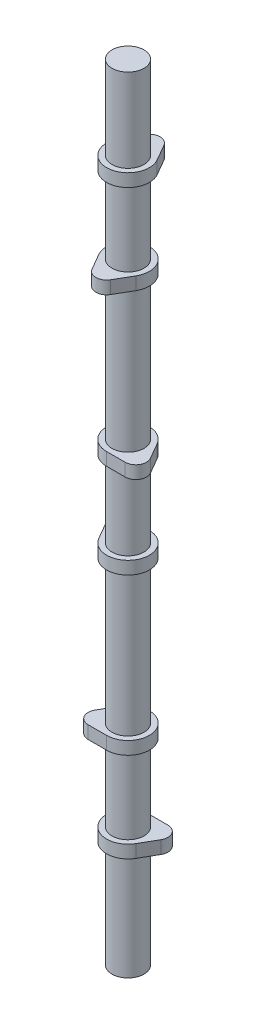
ISO-10303-21;
HEADER;
FILE_DESCRIPTION(('STEP AP214'),'2;1');
FILE_NAME('part.step','',(''),(''),'','','');
FILE_SCHEMA(('AUTOMOTIVE_DESIGN { 1 0 10303 214 1 1 1 1 }'));
ENDSEC;
DATA;
#1=APPLICATION_CONTEXT('core data for automotive mechanical design processes');
#2=APPLICATION_PROTOCOL_DEFINITION('international standard','automotive_design',2000,#1);
#3=PRODUCT_CONTEXT('',#1,'mechanical');
#4=PRODUCT('Part','Part','',(#3));
#5=PRODUCT_RELATED_PRODUCT_CATEGORY('part','',(#4));
#6=PRODUCT_DEFINITION_FORMATION('','',#4);
#7=PRODUCT_DEFINITION_CONTEXT('part definition',#1,'design');
#8=PRODUCT_DEFINITION('design','',#6,#7);
#9=PRODUCT_DEFINITION_SHAPE('','',#8);
#10=(LENGTH_UNIT() NAMED_UNIT(*) SI_UNIT(.MILLI.,.METRE.));
#11=(NAMED_UNIT(*) PLANE_ANGLE_UNIT() SI_UNIT($,.RADIAN.));
#12=(NAMED_UNIT(*) SI_UNIT($,.STERADIAN.) SOLID_ANGLE_UNIT());
#13=UNCERTAINTY_MEASURE_WITH_UNIT(LENGTH_MEASURE(1.E-05),#10,'distance_accuracy_value','');
#14=(GEOMETRIC_REPRESENTATION_CONTEXT(3) GLOBAL_UNCERTAINTY_ASSIGNED_CONTEXT((#13)) GLOBAL_UNIT_ASSIGNED_CONTEXT((#10,
#11,#12)) REPRESENTATION_CONTEXT('',''));
#15=CARTESIAN_POINT('',(0.,0.,0.));
#16=DIRECTION('',(0.,0.,1.));
#17=DIRECTION('',(1.,0.,0.));
#18=AXIS2_PLACEMENT_3D('',#15,#16,#17);
#19=CARTESIAN_POINT('',(0.,7.62,-12.7));
#20=DIRECTION('',(0.,-1.,0.));
#21=DIRECTION('',(0.,0.,-1.));
#22=AXIS2_PLACEMENT_3D('',#19,#20,#21);
#23=CYLINDRICAL_SURFACE('',#22,6.35);
#24=CARTESIAN_POINT('',(0.,0.,-12.7));
#25=DIRECTION('',(0.,1.,0.));
#26=DIRECTION('',(0.,0.,1.));
#27=AXIS2_PLACEMENT_3D('',#24,#25,#26);
#28=CIRCLE('',#27,6.35);
#29=CARTESIAN_POINT('',(5.49926131403118,0.,-15.875));
#30=VERTEX_POINT('',#29);
#31=CARTESIAN_POINT('',(-5.49926131403119,0.,-15.875));
#32=VERTEX_POINT('',#31);
#33=EDGE_CURVE('E383',#30,#32,#28,.T.);
#34=ORIENTED_EDGE('',*,*,#33,.T.);
#35=DIRECTION('',(0.,-1.,0.));
#36=VECTOR('',#35,1.);
#37=CARTESIAN_POINT('',(-5.49926131403119,7.62,-15.875));
#38=LINE('',#37,#36);
#39=CARTESIAN_POINT('',(-5.49926131403119,7.62,-15.875));
#40=VERTEX_POINT('',#39);
#41=EDGE_CURVE('E375',#40,#32,#38,.T.);
#42=ORIENTED_EDGE('',*,*,#41,.F.);
#43=CARTESIAN_POINT('',(0.,7.62,-12.7));
#44=DIRECTION('',(0.,1.,0.));
#45=DIRECTION('',(0.,0.,1.));
#46=AXIS2_PLACEMENT_3D('',#43,#44,#45);
#47=CIRCLE('',#46,6.35);
#48=CARTESIAN_POINT('',(5.49926131403118,7.62,-15.875));
#49=VERTEX_POINT('',#48);
#50=EDGE_CURVE('E376',#49,#40,#47,.T.);
#51=ORIENTED_EDGE('',*,*,#50,.F.);
#52=DIRECTION('',(0.,-1.,0.));
#53=VECTOR('',#52,1.);
#54=CARTESIAN_POINT('',(5.49926131403118,7.62,-15.875));
#55=LINE('',#54,#53);
#56=EDGE_CURVE('E382',#49,#30,#55,.T.);
#57=ORIENTED_EDGE('',*,*,#56,.T.);
#58=EDGE_LOOP('',(#34,#42,#51,#57));
#59=FACE_BOUND('',#58,.T.);
#60=ADVANCED_FACE('F37',(#59),#23,.T.);
#61=CARTESIAN_POINT('',(-5.49926131403119,7.62,-15.875));
#62=DIRECTION('',(0.866025403784439,0.,0.5));
#63=DIRECTION('',(0.5,0.,-0.866025403784439));
#64=AXIS2_PLACEMENT_3D('',#61,#62,#63);
#65=PLANE('',#64);
#66=DIRECTION('',(-0.5,0.,0.866025403784439));
#67=VECTOR('',#66,1.);
#68=CARTESIAN_POINT('',(-5.49926131403119,0.,-15.875));
#69=LINE('',#68,#67);
#70=CARTESIAN_POINT('',(-10.9985226280624,0.,-6.35));
#71=VERTEX_POINT('',#70);
#72=EDGE_CURVE('E386',#32,#71,#69,.T.);
#73=ORIENTED_EDGE('',*,*,#72,.T.);
#74=DIRECTION('',(0.,-1.,0.));
#75=VECTOR('',#74,1.);
#76=CARTESIAN_POINT('',(-10.9985226280624,7.62,-6.35));
#77=LINE('',#76,#75);
#78=CARTESIAN_POINT('',(-10.9985226280624,7.62,-6.35));
#79=VERTEX_POINT('',#78);
#80=EDGE_CURVE('E393',#79,#71,#77,.T.);
#81=ORIENTED_EDGE('',*,*,#80,.F.);
#82=DIRECTION('',(-0.5,0.,0.866025403784439));
#83=VECTOR('',#82,1.);
#84=CARTESIAN_POINT('',(-5.49926131403119,7.62,-15.875));
#85=LINE('',#84,#83);
#86=EDGE_CURVE('E85',#40,#79,#85,.T.);
#87=ORIENTED_EDGE('',*,*,#86,.F.);
#88=ORIENTED_EDGE('',*,*,#41,.T.);
#89=EDGE_LOOP('',(#73,#81,#87,#88));
#90=FACE_BOUND('',#89,.T.);
#91=ADVANCED_FACE('F462',(#90),#65,.F.);
#92=CARTESIAN_POINT('',(0.,7.62,0.));
#93=DIRECTION('',(0.,-1.,0.));
#94=DIRECTION('',(0.,0.,-1.));
#95=AXIS2_PLACEMENT_3D('',#92,#93,#94);
#96=CYLINDRICAL_SURFACE('',#95,12.7);
#97=CARTESIAN_POINT('',(0.,0.,0.));
#98=DIRECTION('',(0.,1.,0.));
#99=DIRECTION('',(0.,0.,1.));
#100=AXIS2_PLACEMENT_3D('',#97,#98,#99);
#101=CIRCLE('',#100,12.7);
#102=CARTESIAN_POINT('',(10.9985226280624,0.,-6.35000000000001));
#103=VERTEX_POINT('',#102);
#104=EDGE_CURVE('E71',#71,#103,#101,.T.);
#105=ORIENTED_EDGE('',*,*,#104,.T.);
#106=DIRECTION('',(0.,-1.,0.));
#107=VECTOR('',#106,1.);
#108=CARTESIAN_POINT('',(10.9985226280624,7.62,-6.35000000000001));
#109=LINE('',#108,#107);
#110=CARTESIAN_POINT('',(10.9985226280624,7.62,-6.35000000000001));
#111=VERTEX_POINT('',#110);
#112=EDGE_CURVE('E391',#111,#103,#109,.T.);
#113=ORIENTED_EDGE('',*,*,#112,.F.);
#114=CARTESIAN_POINT('',(0.,7.62,0.));
#115=DIRECTION('',(0.,1.,0.));
#116=DIRECTION('',(0.,0.,1.));
#117=AXIS2_PLACEMENT_3D('',#114,#115,#116);
#118=CIRCLE('',#117,12.7);
#119=EDGE_CURVE('E379',#79,#111,#118,.T.);
#120=ORIENTED_EDGE('',*,*,#119,.F.);
#121=ORIENTED_EDGE('',*,*,#80,.T.);
#122=EDGE_LOOP('',(#105,#113,#120,#121));
#123=FACE_BOUND('',#122,.T.);
#124=ADVANCED_FACE('F467',(#123),#96,.T.);
#125=CARTESIAN_POINT('',(5.49926131403118,7.62,-15.875));
#126=DIRECTION('',(-0.866025403784439,0.,0.5));
#127=DIRECTION('',(0.5,0.,0.866025403784439));
#128=AXIS2_PLACEMENT_3D('',#125,#126,#127);
#129=PLANE('',#128);
#130=DIRECTION('',(-0.5,0.,-0.866025403784439));
#131=VECTOR('',#130,1.);
#132=CARTESIAN_POINT('',(5.49926131403118,0.,-15.875));
#133=LINE('',#132,#131);
#134=EDGE_CURVE('E77',#103,#30,#133,.T.);
#135=ORIENTED_EDGE('',*,*,#134,.T.);
#136=ORIENTED_EDGE('',*,*,#56,.F.);
#137=DIRECTION('',(-0.5,0.,-0.866025403784439));
#138=VECTOR('',#137,1.);
#139=CARTESIAN_POINT('',(5.49926131403118,7.62,-15.875));
#140=LINE('',#139,#138);
#141=EDGE_CURVE('E53',#111,#49,#140,.T.);
#142=ORIENTED_EDGE('',*,*,#141,.F.);
#143=ORIENTED_EDGE('',*,*,#112,.T.);
#144=EDGE_LOOP('',(#135,#136,#142,#143));
#145=FACE_BOUND('',#144,.T.);
#146=ADVANCED_FACE('F476',(#145),#129,.F.);
#147=CARTESIAN_POINT('',(0.,7.62,-12.7));
#148=DIRECTION('',(0.,1.,0.));
#149=DIRECTION('',(0.,0.,1.));
#150=AXIS2_PLACEMENT_3D('',#147,#148,#149);
#151=PLANE('',#150);
#152=CARTESIAN_POINT('',(0.,7.62000000000002,0.));
#153=DIRECTION('',(0.,1.,0.));
#154=DIRECTION('',(0.,0.,1.));
#155=AXIS2_PLACEMENT_3D('',#152,#153,#154);
#156=CIRCLE('',#155,9.5);
#157=CARTESIAN_POINT('',(0.,7.62000000000002,9.5));
#158=VERTEX_POINT('',#157);
#159=EDGE_CURVE('E371',#158,#158,#156,.T.);
#160=ORIENTED_EDGE('',*,*,#159,.F.);
#161=EDGE_LOOP('',(#160));
#162=FACE_BOUND('',#161,.T.);
#163=ORIENTED_EDGE('',*,*,#50,.T.);
#164=ORIENTED_EDGE('',*,*,#86,.T.);
#165=ORIENTED_EDGE('',*,*,#119,.T.);
#166=ORIENTED_EDGE('',*,*,#141,.T.);
#167=EDGE_LOOP('',(#163,#164,#165,#166));
#168=FACE_BOUND('',#167,.T.);
#169=ADVANCED_FACE('F474',(#162,#168),#151,.T.);
#170=CARTESIAN_POINT('',(0.,0.,-12.7));
#171=DIRECTION('',(0.,1.,0.));
#172=DIRECTION('',(0.,0.,1.));
#173=AXIS2_PLACEMENT_3D('',#170,#171,#172);
#174=PLANE('',#173);
#175=CARTESIAN_POINT('',(0.,0.,0.));
#176=DIRECTION('',(0.,1.,0.));
#177=DIRECTION('',(0.,0.,1.));
#178=AXIS2_PLACEMENT_3D('',#175,#176,#177);
#179=CIRCLE('',#178,9.5);
#180=CARTESIAN_POINT('',(0.,0.,9.5));
#181=VERTEX_POINT('',#180);
#182=EDGE_CURVE('E367',#181,#181,#179,.T.);
#183=ORIENTED_EDGE('',*,*,#182,.T.);
#184=EDGE_LOOP('',(#183));
#185=FACE_BOUND('',#184,.T.);
#186=ORIENTED_EDGE('',*,*,#33,.F.);
#187=ORIENTED_EDGE('',*,*,#134,.F.);
#188=ORIENTED_EDGE('',*,*,#104,.F.);
#189=ORIENTED_EDGE('',*,*,#72,.F.);
#190=EDGE_LOOP('',(#186,#187,#188,#189));
#191=FACE_BOUND('',#190,.T.);
#192=ADVANCED_FACE('F472',(#185,#191),#174,.F.);
#193=CARTESIAN_POINT('',(0.,-408.94,0.));
#194=DIRECTION('',(0.,1.,0.));
#195=DIRECTION('',(0.,0.,1.));
#196=AXIS2_PLACEMENT_3D('',#193,#194,#195);
#197=CYLINDRICAL_SURFACE('',#196,9.5);
#198=CARTESIAN_POINT('',(0.,-45.72,0.));
#199=DIRECTION('',(0.,1.,0.));
#200=DIRECTION('',(0.,0.,1.));
#201=AXIS2_PLACEMENT_3D('',#198,#199,#200);
#202=CIRCLE('',#201,9.5);
#203=CARTESIAN_POINT('',(0.,-45.72,9.5));
#204=VERTEX_POINT('',#203);
#205=EDGE_CURVE('E374',#204,#204,#202,.F.);
#206=ORIENTED_EDGE('',*,*,#205,.F.);
#207=EDGE_LOOP('',(#206));
#208=FACE_BOUND('',#207,.T.);
#209=ORIENTED_EDGE('',*,*,#182,.F.);
#210=EDGE_LOOP('',(#209));
#211=FACE_BOUND('',#210,.T.);
#212=ADVANCED_FACE('F483',(#208,#211),#197,.T.);
#213=ORIENTED_EDGE('',*,*,#159,.T.);
#214=EDGE_LOOP('',(#213));
#215=FACE_BOUND('',#214,.T.);
#216=CARTESIAN_POINT('',(0.,57.15,0.));
#217=DIRECTION('',(0.,1.,0.));
#218=DIRECTION('',(0.,0.,1.));
#219=AXIS2_PLACEMENT_3D('',#216,#217,#218);
#220=CIRCLE('',#219,9.5);
#221=CARTESIAN_POINT('',(0.,57.15,9.5));
#222=VERTEX_POINT('',#221);
#223=EDGE_CURVE('E368',#222,#222,#220,.T.);
#224=ORIENTED_EDGE('',*,*,#223,.F.);
#225=EDGE_LOOP('',(#224));
#226=FACE_BOUND('',#225,.T.);
#227=ADVANCED_FACE('F488',(#215,#226),#197,.T.);
#228=CARTESIAN_POINT('',(0.,57.15,0.));
#229=DIRECTION('',(0.,1.,0.));
#230=DIRECTION('',(0.,0.,1.));
#231=AXIS2_PLACEMENT_3D('',#228,#229,#230);
#232=PLANE('',#231);
#233=ORIENTED_EDGE('',*,*,#223,.T.);
#234=EDGE_LOOP('',(#233));
#235=FACE_BOUND('',#234,.T.);
#236=ADVANCED_FACE('F534',(#235),#232,.T.);
#237=CARTESIAN_POINT('',(0.,-45.72,12.7));
#238=DIRECTION('',(0.,-1.,0.));
#239=DIRECTION('',(0.,0.,1.));
#240=AXIS2_PLACEMENT_3D('',#237,#238,#239);
#241=CYLINDRICAL_SURFACE('',#240,6.35);
#242=CARTESIAN_POINT('',(0.,-53.34,12.7));
#243=DIRECTION('',(0.,1.,0.));
#244=DIRECTION('',(0.,0.,-1.));
#245=AXIS2_PLACEMENT_3D('',#242,#243,#244);
#246=CIRCLE('',#245,6.35);
#247=CARTESIAN_POINT('',(-5.49926131403129,-53.34,15.875));
#248=VERTEX_POINT('',#247);
#249=CARTESIAN_POINT('',(5.49926131403107,-53.34,15.875));
#250=VERTEX_POINT('',#249);
#251=EDGE_CURVE('E344',#248,#250,#246,.T.);
#252=ORIENTED_EDGE('',*,*,#251,.T.);
#253=DIRECTION('',(0.,-1.,0.));
#254=VECTOR('',#253,1.);
#255=CARTESIAN_POINT('',(5.49926131403107,-45.72,15.875));
#256=LINE('',#255,#254);
#257=CARTESIAN_POINT('',(5.49926131403107,-45.72,15.875));
#258=VERTEX_POINT('',#257);
#259=EDGE_CURVE('E360',#258,#250,#256,.T.);
#260=ORIENTED_EDGE('',*,*,#259,.F.);
#261=CARTESIAN_POINT('',(0.,-45.72,12.7));
#262=DIRECTION('',(0.,1.,0.));
#263=DIRECTION('',(0.,0.,-1.));
#264=AXIS2_PLACEMENT_3D('',#261,#262,#263);
#265=CIRCLE('',#264,6.35);
#266=CARTESIAN_POINT('',(-5.49926131403129,-45.72,15.875));
#267=VERTEX_POINT('',#266);
#268=EDGE_CURVE('E333',#267,#258,#265,.T.);
#269=ORIENTED_EDGE('',*,*,#268,.F.);
#270=DIRECTION('',(0.,-1.,0.));
#271=VECTOR('',#270,1.);
#272=CARTESIAN_POINT('',(-5.49926131403129,-45.72,15.875));
#273=LINE('',#272,#271);
#274=EDGE_CURVE('E343',#267,#248,#273,.T.);
#275=ORIENTED_EDGE('',*,*,#274,.T.);
#276=EDGE_LOOP('',(#252,#260,#269,#275));
#277=FACE_BOUND('',#276,.T.);
#278=ADVANCED_FACE('F545',(#277),#241,.T.);
#279=CARTESIAN_POINT('',(5.49926131403107,-45.72,15.875));
#280=DIRECTION('',(-0.866025403784435,0.,-0.500000000000006));
#281=DIRECTION('',(-0.500000000000006,0.,0.866025403784435));
#282=AXIS2_PLACEMENT_3D('',#279,#280,#281);
#283=PLANE('',#282);
#284=DIRECTION('',(0.500000000000006,0.,-0.866025403784435));
#285=VECTOR('',#284,1.);
#286=CARTESIAN_POINT('',(5.49926131403107,-53.34,15.875));
#287=LINE('',#286,#285);
#288=CARTESIAN_POINT('',(10.9985226280623,-53.34,6.35000000000008));
#289=VERTEX_POINT('',#288);
#290=EDGE_CURVE('E347',#250,#289,#287,.T.);
#291=ORIENTED_EDGE('',*,*,#290,.T.);
#292=DIRECTION('',(0.,-1.,0.));
#293=VECTOR('',#292,1.);
#294=CARTESIAN_POINT('',(10.9985226280623,-45.72,6.35000000000008));
#295=LINE('',#294,#293);
#296=CARTESIAN_POINT('',(10.9985226280623,-45.72,6.35000000000008));
#297=VERTEX_POINT('',#296);
#298=EDGE_CURVE('E357',#297,#289,#295,.T.);
#299=ORIENTED_EDGE('',*,*,#298,.F.);
#300=DIRECTION('',(0.500000000000006,0.,-0.866025403784435));
#301=VECTOR('',#300,1.);
#302=CARTESIAN_POINT('',(5.49926131403107,-45.72,15.875));
#303=LINE('',#302,#301);
#304=EDGE_CURVE('E336',#258,#297,#303,.T.);
#305=ORIENTED_EDGE('',*,*,#304,.F.);
#306=ORIENTED_EDGE('',*,*,#259,.T.);
#307=EDGE_LOOP('',(#291,#299,#305,#306));
#308=FACE_BOUND('',#307,.T.);
#309=ADVANCED_FACE('F555',(#308),#283,.F.);
#310=CARTESIAN_POINT('',(0.,-45.72,0.));
#311=DIRECTION('',(0.,-1.,0.));
#312=DIRECTION('',(0.,0.,1.));
#313=AXIS2_PLACEMENT_3D('',#310,#311,#312);
#314=CYLINDRICAL_SURFACE('',#313,12.7);
#315=CARTESIAN_POINT('',(0.,-53.34,0.));
#316=DIRECTION('',(0.,1.,0.));
#317=DIRECTION('',(0.,0.,-1.));
#318=AXIS2_PLACEMENT_3D('',#315,#316,#317);
#319=CIRCLE('',#318,12.7);
#320=CARTESIAN_POINT('',(-10.9985226280624,-53.34,6.34999999999994));
#321=VERTEX_POINT('',#320);
#322=EDGE_CURVE('E349',#289,#321,#319,.T.);
#323=ORIENTED_EDGE('',*,*,#322,.T.);
#324=DIRECTION('',(0.,-1.,0.));
#325=VECTOR('',#324,1.);
#326=CARTESIAN_POINT('',(-10.9985226280624,-45.72,6.34999999999994));
#327=LINE('',#326,#325);
#328=CARTESIAN_POINT('',(-10.9985226280624,-45.72,6.34999999999994));
#329=VERTEX_POINT('',#328);
#330=EDGE_CURVE('E354',#329,#321,#327,.T.);
#331=ORIENTED_EDGE('',*,*,#330,.F.);
#332=CARTESIAN_POINT('',(0.,-45.72,0.));
#333=DIRECTION('',(0.,1.,0.));
#334=DIRECTION('',(0.,0.,-1.));
#335=AXIS2_PLACEMENT_3D('',#332,#333,#334);
#336=CIRCLE('',#335,12.7);
#337=EDGE_CURVE('E339',#297,#329,#336,.T.);
#338=ORIENTED_EDGE('',*,*,#337,.F.);
#339=ORIENTED_EDGE('',*,*,#298,.T.);
#340=EDGE_LOOP('',(#323,#331,#338,#339));
#341=FACE_BOUND('',#340,.T.);
#342=ADVANCED_FACE('F566',(#341),#314,.T.);
#343=CARTESIAN_POINT('',(-5.49926131403129,-45.72,15.875));
#344=DIRECTION('',(0.866025403784442,0.,-0.499999999999994));
#345=DIRECTION('',(-0.499999999999994,0.,-0.866025403784442));
#346=AXIS2_PLACEMENT_3D('',#343,#344,#345);
#347=PLANE('',#346);
#348=DIRECTION('',(0.499999999999994,0.,0.866025403784442));
#349=VECTOR('',#348,1.);
#350=CARTESIAN_POINT('',(-5.49926131403129,-53.34,15.875));
#351=LINE('',#350,#349);
#352=EDGE_CURVE('E337',#321,#248,#351,.T.);
#353=ORIENTED_EDGE('',*,*,#352,.T.);
#354=ORIENTED_EDGE('',*,*,#274,.F.);
#355=DIRECTION('',(0.499999999999994,0.,0.866025403784442));
#356=VECTOR('',#355,1.);
#357=CARTESIAN_POINT('',(-5.49926131403129,-45.72,15.875));
#358=LINE('',#357,#356);
#359=EDGE_CURVE('E341',#329,#267,#358,.T.);
#360=ORIENTED_EDGE('',*,*,#359,.F.);
#361=ORIENTED_EDGE('',*,*,#330,.T.);
#362=EDGE_LOOP('',(#353,#354,#360,#361));
#363=FACE_BOUND('',#362,.T.);
#364=ADVANCED_FACE('F577',(#363),#347,.F.);
#365=CARTESIAN_POINT('',(0.,-45.72,12.7));
#366=DIRECTION('',(0.,1.,0.));
#367=DIRECTION('',(0.,0.,-1.));
#368=AXIS2_PLACEMENT_3D('',#365,#366,#367);
#369=PLANE('',#368);
#370=ORIENTED_EDGE('',*,*,#205,.T.);
#371=EDGE_LOOP('',(#370));
#372=FACE_BOUND('',#371,.T.);
#373=ORIENTED_EDGE('',*,*,#268,.T.);
#374=ORIENTED_EDGE('',*,*,#304,.T.);
#375=ORIENTED_EDGE('',*,*,#337,.T.);
#376=ORIENTED_EDGE('',*,*,#359,.T.);
#377=EDGE_LOOP('',(#373,#374,#375,#376));
#378=FACE_BOUND('',#377,.T.);
#379=ADVANCED_FACE('F588',(#372,#378),#369,.T.);
#380=CARTESIAN_POINT('',(0.,-53.34,12.7));
#381=DIRECTION('',(0.,1.,0.));
#382=DIRECTION('',(0.,0.,-1.));
#383=AXIS2_PLACEMENT_3D('',#380,#381,#382);
#384=PLANE('',#383);
#385=CARTESIAN_POINT('',(0.,-53.34,0.));
#386=DIRECTION('',(0.,1.,0.));
#387=DIRECTION('',(0.,0.,1.));
#388=AXIS2_PLACEMENT_3D('',#385,#386,#387);
#389=CIRCLE('',#388,9.5);
#390=CARTESIAN_POINT('',(0.,-53.34,9.5));
#391=VERTEX_POINT('',#390);
#392=EDGE_CURVE('E363',#391,#391,#389,.F.);
#393=ORIENTED_EDGE('',*,*,#392,.F.);
#394=EDGE_LOOP('',(#393));
#395=FACE_BOUND('',#394,.T.);
#396=ORIENTED_EDGE('',*,*,#251,.F.);
#397=ORIENTED_EDGE('',*,*,#352,.F.);
#398=ORIENTED_EDGE('',*,*,#322,.F.);
#399=ORIENTED_EDGE('',*,*,#290,.F.);
#400=EDGE_LOOP('',(#396,#397,#398,#399));
#401=FACE_BOUND('',#400,.T.);
#402=ADVANCED_FACE('F599',(#395,#401),#384,.F.);
#403=CARTESIAN_POINT('',(0.,-138.43,0.));
#404=DIRECTION('',(0.,1.,0.));
#405=DIRECTION('',(0.,0.,1.));
#406=AXIS2_PLACEMENT_3D('',#403,#404,#405);
#407=CIRCLE('',#406,9.5);
#408=CARTESIAN_POINT('',(0.,-138.43,9.5));
#409=VERTEX_POINT('',#408);
#410=EDGE_CURVE('E402',#409,#409,#407,.F.);
#411=ORIENTED_EDGE('',*,*,#410,.F.);
#412=EDGE_LOOP('',(#411));
#413=FACE_BOUND('',#412,.T.);
#414=ORIENTED_EDGE('',*,*,#392,.T.);
#415=EDGE_LOOP('',(#414));
#416=FACE_BOUND('',#415,.T.);
#417=ADVANCED_FACE('F524',(#413,#416),#197,.T.);
#418=CARTESIAN_POINT('',(10.9985226280623,-138.43,6.35000000000005));
#419=DIRECTION('',(0.,-1.,0.));
#420=DIRECTION('',(0.866025403784436,0.,0.500000000000004));
#421=AXIS2_PLACEMENT_3D('',#418,#419,#420);
#422=CYLINDRICAL_SURFACE('',#421,6.35);
#423=CARTESIAN_POINT('',(10.9985226280623,-146.05,6.35000000000005));
#424=DIRECTION('',(0.,1.,0.));
#425=DIRECTION('',(-0.866025403784436,0.,-0.500000000000004));
#426=AXIS2_PLACEMENT_3D('',#423,#424,#425);
#427=CIRCLE('',#426,6.35);
#428=CARTESIAN_POINT('',(10.9985226280623,-146.05,12.7000000000001));
#429=VERTEX_POINT('',#428);
#430=CARTESIAN_POINT('',(16.4977839420935,-146.05,3.17500000000008));
#431=VERTEX_POINT('',#430);
#432=EDGE_CURVE('E313',#429,#431,#427,.T.);
#433=ORIENTED_EDGE('',*,*,#432,.T.);
#434=DIRECTION('',(0.,-1.,0.));
#435=VECTOR('',#434,1.);
#436=CARTESIAN_POINT('',(16.4977839420935,-138.43,3.17500000000008));
#437=LINE('',#436,#435);
#438=CARTESIAN_POINT('',(16.4977839420935,-138.43,3.17500000000008));
#439=VERTEX_POINT('',#438);
#440=EDGE_CURVE('E329',#439,#431,#437,.T.);
#441=ORIENTED_EDGE('',*,*,#440,.F.);
#442=CARTESIAN_POINT('',(10.9985226280623,-138.43,6.35000000000005));
#443=DIRECTION('',(0.,1.,0.));
#444=DIRECTION('',(-0.866025403784436,0.,-0.500000000000004));
#445=AXIS2_PLACEMENT_3D('',#442,#443,#444);
#446=CIRCLE('',#445,6.35);
#447=CARTESIAN_POINT('',(10.9985226280623,-138.43,12.7000000000001));
#448=VERTEX_POINT('',#447);
#449=EDGE_CURVE('E302',#448,#439,#446,.T.);
#450=ORIENTED_EDGE('',*,*,#449,.F.);
#451=DIRECTION('',(0.,-1.,0.));
#452=VECTOR('',#451,1.);
#453=CARTESIAN_POINT('',(10.9985226280623,-138.43,12.7000000000001));
#454=LINE('',#453,#452);
#455=EDGE_CURVE('E312',#448,#429,#454,.T.);
#456=ORIENTED_EDGE('',*,*,#455,.T.);
#457=EDGE_LOOP('',(#433,#441,#450,#456));
#458=FACE_BOUND('',#457,.T.);
#459=ADVANCED_FACE('F620',(#458),#422,.T.);
#460=CARTESIAN_POINT('',(16.4977839420935,-138.43,3.17500000000008));
#461=DIRECTION('',(-0.866025403784441,0.,0.499999999999996));
#462=DIRECTION('',(0.499999999999996,0.,0.866025403784441));
#463=AXIS2_PLACEMENT_3D('',#460,#461,#462);
#464=PLANE('',#463);
#465=DIRECTION('',(-0.499999999999996,0.,-0.866025403784441));
#466=VECTOR('',#465,1.);
#467=CARTESIAN_POINT('',(16.4977839420935,-146.05,3.17500000000008));
#468=LINE('',#467,#466);
#469=CARTESIAN_POINT('',(10.9985226280624,-146.05,-6.34999999999995));
#470=VERTEX_POINT('',#469);
#471=EDGE_CURVE('E316',#431,#470,#468,.T.);
#472=ORIENTED_EDGE('',*,*,#471,.T.);
#473=DIRECTION('',(0.,-1.,0.));
#474=VECTOR('',#473,1.);
#475=CARTESIAN_POINT('',(10.9985226280624,-138.43,-6.34999999999995));
#476=LINE('',#475,#474);
#477=CARTESIAN_POINT('',(10.9985226280624,-138.43,-6.34999999999995));
#478=VERTEX_POINT('',#477);
#479=EDGE_CURVE('E326',#478,#470,#476,.T.);
#480=ORIENTED_EDGE('',*,*,#479,.F.);
#481=DIRECTION('',(-0.499999999999996,0.,-0.866025403784441));
#482=VECTOR('',#481,1.);
#483=CARTESIAN_POINT('',(16.4977839420935,-138.43,3.17500000000008));
#484=LINE('',#483,#482);
#485=EDGE_CURVE('E305',#439,#478,#484,.T.);
#486=ORIENTED_EDGE('',*,*,#485,.F.);
#487=ORIENTED_EDGE('',*,*,#440,.T.);
#488=EDGE_LOOP('',(#472,#480,#486,#487));
#489=FACE_BOUND('',#488,.T.);
#490=ADVANCED_FACE('F630',(#489),#464,.F.);
#491=CARTESIAN_POINT('',(0.,-138.43,0.));
#492=DIRECTION('',(0.,-1.,0.));
#493=DIRECTION('',(0.866025403784436,0.,0.500000000000004));
#494=AXIS2_PLACEMENT_3D('',#491,#492,#493);
#495=CYLINDRICAL_SURFACE('',#494,12.7);
#496=CARTESIAN_POINT('',(0.,-146.05,0.));
#497=DIRECTION('',(0.,1.,0.));
#498=DIRECTION('',(-0.866025403784436,0.,-0.500000000000004));
#499=AXIS2_PLACEMENT_3D('',#496,#497,#498);
#500=CIRCLE('',#499,12.7);
#501=CARTESIAN_POINT('',(0.,-146.05,12.7));
#502=VERTEX_POINT('',#501);
#503=EDGE_CURVE('E318',#470,#502,#500,.T.);
#504=ORIENTED_EDGE('',*,*,#503,.T.);
#505=DIRECTION('',(0.,-1.,0.));
#506=VECTOR('',#505,1.);
#507=CARTESIAN_POINT('',(0.,-138.43,12.7));
#508=LINE('',#507,#506);
#509=CARTESIAN_POINT('',(0.,-138.43,12.7));
#510=VERTEX_POINT('',#509);
#511=EDGE_CURVE('E323',#510,#502,#508,.T.);
#512=ORIENTED_EDGE('',*,*,#511,.F.);
#513=CARTESIAN_POINT('',(0.,-138.43,0.));
#514=DIRECTION('',(0.,1.,0.));
#515=DIRECTION('',(-0.866025403784436,0.,-0.500000000000004));
#516=AXIS2_PLACEMENT_3D('',#513,#514,#515);
#517=CIRCLE('',#516,12.7);
#518=EDGE_CURVE('E308',#478,#510,#517,.T.);
#519=ORIENTED_EDGE('',*,*,#518,.F.);
#520=ORIENTED_EDGE('',*,*,#479,.T.);
#521=EDGE_LOOP('',(#504,#512,#519,#520));
#522=FACE_BOUND('',#521,.T.);
#523=ADVANCED_FACE('F641',(#522),#495,.T.);
#524=CARTESIAN_POINT('',(10.9985226280623,-138.43,12.7000000000001));
#525=DIRECTION('',(0.,0.,-1.));
#526=DIRECTION('',(-1.,0.,0.));
#527=AXIS2_PLACEMENT_3D('',#524,#525,#526);
#528=PLANE('',#527);
#529=DIRECTION('',(1.,0.,0.));
#530=VECTOR('',#529,1.);
#531=CARTESIAN_POINT('',(10.9985226280623,-146.05,12.7000000000001));
#532=LINE('',#531,#530);
#533=EDGE_CURVE('E306',#502,#429,#532,.T.);
#534=ORIENTED_EDGE('',*,*,#533,.T.);
#535=ORIENTED_EDGE('',*,*,#455,.F.);
#536=DIRECTION('',(1.,0.,0.));
#537=VECTOR('',#536,1.);
#538=CARTESIAN_POINT('',(10.9985226280623,-138.43,12.7000000000001));
#539=LINE('',#538,#537);
#540=EDGE_CURVE('E310',#510,#448,#539,.T.);
#541=ORIENTED_EDGE('',*,*,#540,.F.);
#542=ORIENTED_EDGE('',*,*,#511,.T.);
#543=EDGE_LOOP('',(#534,#535,#541,#542));
#544=FACE_BOUND('',#543,.T.);
#545=ADVANCED_FACE('F652',(#544),#528,.F.);
#546=CARTESIAN_POINT('',(10.9985226280623,-138.43,6.35000000000005));
#547=DIRECTION('',(0.,1.,0.));
#548=DIRECTION('',(-0.866025403784436,0.,-0.500000000000004));
#549=AXIS2_PLACEMENT_3D('',#546,#547,#548);
#550=PLANE('',#549);
#551=ORIENTED_EDGE('',*,*,#410,.T.);
#552=EDGE_LOOP('',(#551));
#553=FACE_BOUND('',#552,.T.);
#554=ORIENTED_EDGE('',*,*,#449,.T.);
#555=ORIENTED_EDGE('',*,*,#485,.T.);
#556=ORIENTED_EDGE('',*,*,#518,.T.);
#557=ORIENTED_EDGE('',*,*,#540,.T.);
#558=EDGE_LOOP('',(#554,#555,#556,#557));
#559=FACE_BOUND('',#558,.T.);
#560=ADVANCED_FACE('F663',(#553,#559),#550,.T.);
#561=CARTESIAN_POINT('',(10.9985226280623,-146.05,6.35000000000005));
#562=DIRECTION('',(0.,1.,0.));
#563=DIRECTION('',(-0.866025403784436,0.,-0.500000000000004));
#564=AXIS2_PLACEMENT_3D('',#561,#562,#563);
#565=PLANE('',#564);
#566=CARTESIAN_POINT('',(0.,-146.05,0.));
#567=DIRECTION('',(0.,1.,0.));
#568=DIRECTION('',(0.,0.,1.));
#569=AXIS2_PLACEMENT_3D('',#566,#567,#568);
#570=CIRCLE('',#569,9.5);
#571=CARTESIAN_POINT('',(0.,-146.05,9.5));
#572=VERTEX_POINT('',#571);
#573=EDGE_CURVE('E332',#572,#572,#570,.F.);
#574=ORIENTED_EDGE('',*,*,#573,.F.);
#575=EDGE_LOOP('',(#574));
#576=FACE_BOUND('',#575,.T.);
#577=ORIENTED_EDGE('',*,*,#432,.F.);
#578=ORIENTED_EDGE('',*,*,#533,.F.);
#579=ORIENTED_EDGE('',*,*,#503,.F.);
#580=ORIENTED_EDGE('',*,*,#471,.F.);
#581=EDGE_LOOP('',(#577,#578,#579,#580));
#582=FACE_BOUND('',#581,.T.);
#583=ADVANCED_FACE('F674',(#576,#582),#565,.F.);
#584=CARTESIAN_POINT('',(0.,-191.77,0.));
#585=DIRECTION('',(0.,1.,0.));
#586=DIRECTION('',(0.,0.,1.));
#587=AXIS2_PLACEMENT_3D('',#584,#585,#586);
#588=CIRCLE('',#587,9.5);
#589=CARTESIAN_POINT('',(0.,-191.77,9.5));
#590=VERTEX_POINT('',#589);
#591=EDGE_CURVE('E407',#590,#590,#588,.F.);
#592=ORIENTED_EDGE('',*,*,#591,.F.);
#593=EDGE_LOOP('',(#592));
#594=FACE_BOUND('',#593,.T.);
#595=ORIENTED_EDGE('',*,*,#573,.T.);
#596=EDGE_LOOP('',(#595));
#597=FACE_BOUND('',#596,.T.);
#598=ADVANCED_FACE('F426',(#594,#597),#197,.T.);
#599=CARTESIAN_POINT('',(-10.9985226280623,-191.77,-6.35000000000013));
#600=DIRECTION('',(0.,-1.,0.));
#601=DIRECTION('',(-0.866025403784433,0.,-0.50000000000001));
#602=AXIS2_PLACEMENT_3D('',#599,#600,#601);
#603=CYLINDRICAL_SURFACE('',#602,6.35);
#604=CARTESIAN_POINT('',(-10.9985226280623,-199.39,-6.35000000000013));
#605=DIRECTION('',(0.,1.,0.));
#606=DIRECTION('',(0.866025403784433,0.,0.50000000000001));
#607=AXIS2_PLACEMENT_3D('',#604,#605,#606);
#608=CIRCLE('',#607,6.35);
#609=CARTESIAN_POINT('',(-10.9985226280622,-199.39,-12.7000000000001));
#610=VERTEX_POINT('',#609);
#611=CARTESIAN_POINT('',(-16.4977839420935,-199.39,-3.17500000000019));
#612=VERTEX_POINT('',#611);
#613=EDGE_CURVE('E282',#610,#612,#608,.T.);
#614=ORIENTED_EDGE('',*,*,#613,.T.);
#615=DIRECTION('',(0.,-1.,0.));
#616=VECTOR('',#615,1.);
#617=CARTESIAN_POINT('',(-16.4977839420935,-191.77,-3.17500000000019));
#618=LINE('',#617,#616);
#619=CARTESIAN_POINT('',(-16.4977839420935,-191.77,-3.17500000000019));
#620=VERTEX_POINT('',#619);
#621=EDGE_CURVE('E298',#620,#612,#618,.T.);
#622=ORIENTED_EDGE('',*,*,#621,.F.);
#623=CARTESIAN_POINT('',(-10.9985226280623,-191.77,-6.35000000000013));
#624=DIRECTION('',(0.,1.,0.));
#625=DIRECTION('',(0.866025403784433,0.,0.50000000000001));
#626=AXIS2_PLACEMENT_3D('',#623,#624,#625);
#627=CIRCLE('',#626,6.35);
#628=CARTESIAN_POINT('',(-10.9985226280622,-191.77,-12.7000000000001));
#629=VERTEX_POINT('',#628);
#630=EDGE_CURVE('E271',#629,#620,#627,.T.);
#631=ORIENTED_EDGE('',*,*,#630,.F.);
#632=DIRECTION('',(0.,-1.,0.));
#633=VECTOR('',#632,1.);
#634=CARTESIAN_POINT('',(-10.9985226280622,-191.77,-12.7000000000001));
#635=LINE('',#634,#633);
#636=EDGE_CURVE('E281',#629,#610,#635,.T.);
#637=ORIENTED_EDGE('',*,*,#636,.T.);
#638=EDGE_LOOP('',(#614,#622,#631,#637));
#639=FACE_BOUND('',#638,.T.);
#640=ADVANCED_FACE('F439',(#639),#603,.T.);
#641=CARTESIAN_POINT('',(-16.4977839420935,-191.77,-3.17500000000019));
#642=DIRECTION('',(0.866025403784445,0.,-0.49999999999999));
#643=DIRECTION('',(-0.49999999999999,0.,-0.866025403784445));
#644=AXIS2_PLACEMENT_3D('',#641,#642,#643);
#645=PLANE('',#644);
#646=DIRECTION('',(0.49999999999999,0.,0.866025403784445));
#647=VECTOR('',#646,1.);
#648=CARTESIAN_POINT('',(-16.4977839420935,-199.39,-3.17500000000019));
#649=LINE('',#648,#647);
#650=CARTESIAN_POINT('',(-10.9985226280624,-199.39,6.34999999999987));
#651=VERTEX_POINT('',#650);
#652=EDGE_CURVE('E285',#612,#651,#649,.T.);
#653=ORIENTED_EDGE('',*,*,#652,.T.);
#654=DIRECTION('',(0.,-1.,0.));
#655=VECTOR('',#654,1.);
#656=CARTESIAN_POINT('',(-10.9985226280624,-191.77,6.34999999999987));
#657=LINE('',#656,#655);
#658=CARTESIAN_POINT('',(-10.9985226280624,-191.77,6.34999999999987));
#659=VERTEX_POINT('',#658);
#660=EDGE_CURVE('E295',#659,#651,#657,.T.);
#661=ORIENTED_EDGE('',*,*,#660,.F.);
#662=DIRECTION('',(0.49999999999999,0.,0.866025403784445));
#663=VECTOR('',#662,1.);
#664=CARTESIAN_POINT('',(-16.4977839420935,-191.77,-3.17500000000019));
#665=LINE('',#664,#663);
#666=EDGE_CURVE('E274',#620,#659,#665,.T.);
#667=ORIENTED_EDGE('',*,*,#666,.F.);
#668=ORIENTED_EDGE('',*,*,#621,.T.);
#669=EDGE_LOOP('',(#653,#661,#667,#668));
#670=FACE_BOUND('',#669,.T.);
#671=ADVANCED_FACE('F451',(#670),#645,.F.);
#672=CARTESIAN_POINT('',(0.,-191.77,0.));
#673=DIRECTION('',(0.,-1.,0.));
#674=DIRECTION('',(-0.866025403784433,0.,-0.50000000000001));
#675=AXIS2_PLACEMENT_3D('',#672,#673,#674);
#676=CYLINDRICAL_SURFACE('',#675,12.7);
#677=CARTESIAN_POINT('',(0.,-199.39,0.));
#678=DIRECTION('',(0.,1.,0.));
#679=DIRECTION('',(0.866025403784433,0.,0.50000000000001));
#680=AXIS2_PLACEMENT_3D('',#677,#678,#679);
#681=CIRCLE('',#680,12.7);
#682=CARTESIAN_POINT('',(1.32706345912226E-13,-199.39,-12.7));
#683=VERTEX_POINT('',#682);
#684=EDGE_CURVE('E287',#651,#683,#681,.T.);
#685=ORIENTED_EDGE('',*,*,#684,.T.);
#686=DIRECTION('',(0.,-1.,0.));
#687=VECTOR('',#686,1.);
#688=CARTESIAN_POINT('',(1.32706345912226E-13,-191.77,-12.7));
#689=LINE('',#688,#687);
#690=CARTESIAN_POINT('',(1.32706345912226E-13,-191.77,-12.7));
#691=VERTEX_POINT('',#690);
#692=EDGE_CURVE('E292',#691,#683,#689,.T.);
#693=ORIENTED_EDGE('',*,*,#692,.F.);
#694=CARTESIAN_POINT('',(0.,-191.77,0.));
#695=DIRECTION('',(0.,1.,0.));
#696=DIRECTION('',(0.866025403784433,0.,0.50000000000001));
#697=AXIS2_PLACEMENT_3D('',#694,#695,#696);
#698=CIRCLE('',#697,12.7);
#699=EDGE_CURVE('E277',#659,#691,#698,.T.);
#700=ORIENTED_EDGE('',*,*,#699,.F.);
#701=ORIENTED_EDGE('',*,*,#660,.T.);
#702=EDGE_LOOP('',(#685,#693,#700,#701));
#703=FACE_BOUND('',#702,.T.);
#704=ADVANCED_FACE('F448',(#703),#676,.T.);
#705=CARTESIAN_POINT('',(-10.9985226280622,-191.77,-12.7000000000001));
#706=DIRECTION('',(0.,0.,1.));
#707=DIRECTION('',(1.,0.,0.));
#708=AXIS2_PLACEMENT_3D('',#705,#706,#707);
#709=PLANE('',#708);
#710=DIRECTION('',(-1.,0.,0.));
#711=VECTOR('',#710,1.);
#712=CARTESIAN_POINT('',(-10.9985226280622,-199.39,-12.7000000000001));
#713=LINE('',#712,#711);
#714=EDGE_CURVE('E275',#683,#610,#713,.T.);
#715=ORIENTED_EDGE('',*,*,#714,.T.);
#716=ORIENTED_EDGE('',*,*,#636,.F.);
#717=DIRECTION('',(-1.,0.,0.));
#718=VECTOR('',#717,1.);
#719=CARTESIAN_POINT('',(-10.9985226280622,-191.77,-12.7000000000001));
#720=LINE('',#719,#718);
#721=EDGE_CURVE('E279',#691,#629,#720,.T.);
#722=ORIENTED_EDGE('',*,*,#721,.F.);
#723=ORIENTED_EDGE('',*,*,#692,.T.);
#724=EDGE_LOOP('',(#715,#716,#722,#723));
#725=FACE_BOUND('',#724,.T.);
#726=ADVANCED_FACE('F444',(#725),#709,.F.);
#727=CARTESIAN_POINT('',(-10.9985226280623,-191.77,-6.35000000000013));
#728=DIRECTION('',(0.,1.,0.));
#729=DIRECTION('',(0.866025403784433,0.,0.50000000000001));
#730=AXIS2_PLACEMENT_3D('',#727,#728,#729);
#731=PLANE('',#730);
#732=ORIENTED_EDGE('',*,*,#591,.T.);
#733=EDGE_LOOP('',(#732));
#734=FACE_BOUND('',#733,.T.);
#735=ORIENTED_EDGE('',*,*,#630,.T.);
#736=ORIENTED_EDGE('',*,*,#666,.T.);
#737=ORIENTED_EDGE('',*,*,#699,.T.);
#738=ORIENTED_EDGE('',*,*,#721,.T.);
#739=EDGE_LOOP('',(#735,#736,#737,#738));
#740=FACE_BOUND('',#739,.T.);
#741=ADVANCED_FACE('F432',(#734,#740),#731,.T.);
#742=CARTESIAN_POINT('',(-10.9985226280623,-199.39,-6.35000000000013));
#743=DIRECTION('',(0.,1.,0.));
#744=DIRECTION('',(0.866025403784433,0.,0.50000000000001));
#745=AXIS2_PLACEMENT_3D('',#742,#743,#744);
#746=PLANE('',#745);
#747=CARTESIAN_POINT('',(0.,-199.39,0.));
#748=DIRECTION('',(0.,1.,0.));
#749=DIRECTION('',(0.,0.,1.));
#750=AXIS2_PLACEMENT_3D('',#747,#748,#749);
#751=CIRCLE('',#750,9.5);
#752=CARTESIAN_POINT('',(0.,-199.39,9.5));
#753=VERTEX_POINT('',#752);
#754=EDGE_CURVE('E301',#753,#753,#751,.F.);
#755=ORIENTED_EDGE('',*,*,#754,.F.);
#756=EDGE_LOOP('',(#755));
#757=FACE_BOUND('',#756,.T.);
#758=ORIENTED_EDGE('',*,*,#613,.F.);
#759=ORIENTED_EDGE('',*,*,#714,.F.);
#760=ORIENTED_EDGE('',*,*,#684,.F.);
#761=ORIENTED_EDGE('',*,*,#652,.F.);
#762=EDGE_LOOP('',(#758,#759,#760,#761));
#763=FACE_BOUND('',#762,.T.);
#764=ADVANCED_FACE('F424',(#757,#763),#746,.F.);
#765=CARTESIAN_POINT('',(0.,-284.48,0.));
#766=DIRECTION('',(0.,1.,0.));
#767=DIRECTION('',(0.,0.,1.));
#768=AXIS2_PLACEMENT_3D('',#765,#766,#767);
#769=CIRCLE('',#768,9.5);
#770=CARTESIAN_POINT('',(0.,-284.48,9.5));
#771=VERTEX_POINT('',#770);
#772=EDGE_CURVE('E45',#771,#771,#769,.F.);
#773=ORIENTED_EDGE('',*,*,#772,.F.);
#774=EDGE_LOOP('',(#773));
#775=FACE_BOUND('',#774,.T.);
#776=ORIENTED_EDGE('',*,*,#754,.T.);
#777=EDGE_LOOP('',(#776));
#778=FACE_BOUND('',#777,.T.);
#779=ADVANCED_FACE('F420',(#775,#778),#197,.T.);
#780=CARTESIAN_POINT('',(-10.9985226280624,-284.48,6.3499999999999));
#781=DIRECTION('',(0.,-1.,0.));
#782=DIRECTION('',(-0.866025403784443,0.,0.499999999999992));
#783=AXIS2_PLACEMENT_3D('',#780,#781,#782);
#784=CYLINDRICAL_SURFACE('',#783,6.35);
#785=CARTESIAN_POINT('',(-10.9985226280624,-292.1,6.3499999999999));
#786=DIRECTION('',(0.,1.,0.));
#787=DIRECTION('',(0.866025403784443,0.,-0.499999999999992));
#788=AXIS2_PLACEMENT_3D('',#785,#786,#787);
#789=CIRCLE('',#788,6.35);
#790=CARTESIAN_POINT('',(-16.4977839420936,-292.1,3.17499999999985));
#791=VERTEX_POINT('',#790);
#792=CARTESIAN_POINT('',(-10.9985226280625,-292.1,12.6999999999999));
#793=VERTEX_POINT('',#792);
#794=EDGE_CURVE('E236',#791,#793,#789,.T.);
#795=ORIENTED_EDGE('',*,*,#794,.T.);
#796=DIRECTION('',(0.,-1.,0.));
#797=VECTOR('',#796,1.);
#798=CARTESIAN_POINT('',(-10.9985226280625,-284.48,12.6999999999999));
#799=LINE('',#798,#797);
#800=CARTESIAN_POINT('',(-10.9985226280625,-284.48,12.6999999999999));
#801=VERTEX_POINT('',#800);
#802=EDGE_CURVE('E267',#801,#793,#799,.T.);
#803=ORIENTED_EDGE('',*,*,#802,.F.);
#804=CARTESIAN_POINT('',(-10.9985226280624,-284.48,6.3499999999999));
#805=DIRECTION('',(0.,1.,0.));
#806=DIRECTION('',(0.866025403784443,0.,-0.499999999999992));
#807=AXIS2_PLACEMENT_3D('',#804,#805,#806);
#808=CIRCLE('',#807,6.35);
#809=CARTESIAN_POINT('',(-16.4977839420936,-284.48,3.17499999999985));
#810=VERTEX_POINT('',#809);
#811=EDGE_CURVE('E241',#810,#801,#808,.T.);
#812=ORIENTED_EDGE('',*,*,#811,.F.);
#813=DIRECTION('',(0.,-1.,0.));
#814=VECTOR('',#813,1.);
#815=CARTESIAN_POINT('',(-16.4977839420936,-284.48,3.17499999999985));
#816=LINE('',#815,#814);
#817=EDGE_CURVE('E251',#810,#791,#816,.T.);
#818=ORIENTED_EDGE('',*,*,#817,.T.);
#819=EDGE_LOOP('',(#795,#803,#812,#818));
#820=FACE_BOUND('',#819,.T.);
#821=ADVANCED_FACE('F423',(#820),#784,.T.);
#822=CARTESIAN_POINT('',(-10.9985226280625,-284.48,12.6999999999999));
#823=DIRECTION('',(0.,0.,-1.));
#824=DIRECTION('',(-1.,0.,0.));
#825=AXIS2_PLACEMENT_3D('',#822,#823,#824);
#826=PLANE('',#825);
#827=DIRECTION('',(1.,0.,0.));
#828=VECTOR('',#827,1.);
#829=CARTESIAN_POINT('',(-10.9985226280625,-292.1,12.6999999999999));
#830=LINE('',#829,#828);
#831=CARTESIAN_POINT('',(-1.17093834628434E-13,-292.1,12.7));
#832=VERTEX_POINT('',#831);
#833=EDGE_CURVE('E254',#793,#832,#830,.T.);
#834=ORIENTED_EDGE('',*,*,#833,.T.);
#835=DIRECTION('',(0.,-1.,0.));
#836=VECTOR('',#835,1.);
#837=CARTESIAN_POINT('',(-1.17093834628434E-13,-284.48,12.7));
#838=LINE('',#837,#836);
#839=CARTESIAN_POINT('',(-1.17093834628434E-13,-284.48,12.7));
#840=VERTEX_POINT('',#839);
#841=EDGE_CURVE('E264',#840,#832,#838,.T.);
#842=ORIENTED_EDGE('',*,*,#841,.F.);
#843=DIRECTION('',(1.,0.,0.));
#844=VECTOR('',#843,1.);
#845=CARTESIAN_POINT('',(-10.9985226280625,-284.48,12.6999999999999));
#846=LINE('',#845,#844);
#847=EDGE_CURVE('E244',#801,#840,#846,.T.);
#848=ORIENTED_EDGE('',*,*,#847,.F.);
#849=ORIENTED_EDGE('',*,*,#802,.T.);
#850=EDGE_LOOP('',(#834,#842,#848,#849));
#851=FACE_BOUND('',#850,.T.);
#852=ADVANCED_FACE('F757',(#851),#826,.F.);
#853=CARTESIAN_POINT('',(0.,-284.48,0.));
#854=DIRECTION('',(0.,-1.,0.));
#855=DIRECTION('',(-0.866025403784443,0.,0.499999999999992));
#856=AXIS2_PLACEMENT_3D('',#853,#854,#855);
#857=CYLINDRICAL_SURFACE('',#856,12.7);
#858=CARTESIAN_POINT('',(0.,-292.1,0.));
#859=DIRECTION('',(0.,1.,0.));
#860=DIRECTION('',(0.866025403784443,0.,-0.499999999999992));
#861=AXIS2_PLACEMENT_3D('',#858,#859,#860);
#862=CIRCLE('',#861,12.7);
#863=CARTESIAN_POINT('',(-10.9985226280623,-292.1,-6.35000000000009));
#864=VERTEX_POINT('',#863);
#865=EDGE_CURVE('E256',#832,#864,#862,.T.);
#866=ORIENTED_EDGE('',*,*,#865,.T.);
#867=DIRECTION('',(0.,-1.,0.));
#868=VECTOR('',#867,1.);
#869=CARTESIAN_POINT('',(-10.9985226280623,-284.48,-6.35000000000009));
#870=LINE('',#869,#868);
#871=CARTESIAN_POINT('',(-10.9985226280623,-284.48,-6.35000000000009));
#872=VERTEX_POINT('',#871);
#873=EDGE_CURVE('E261',#872,#864,#870,.T.);
#874=ORIENTED_EDGE('',*,*,#873,.F.);
#875=CARTESIAN_POINT('',(0.,-284.48,0.));
#876=DIRECTION('',(0.,1.,0.));
#877=DIRECTION('',(0.866025403784443,0.,-0.499999999999992));
#878=AXIS2_PLACEMENT_3D('',#875,#876,#877);
#879=CIRCLE('',#878,12.7);
#880=EDGE_CURVE('E247',#840,#872,#879,.T.);
#881=ORIENTED_EDGE('',*,*,#880,.F.);
#882=ORIENTED_EDGE('',*,*,#841,.T.);
#883=EDGE_LOOP('',(#866,#874,#881,#882));
#884=FACE_BOUND('',#883,.T.);
#885=ADVANCED_FACE('F767',(#884),#857,.T.);
#886=CARTESIAN_POINT('',(-16.4977839420936,-284.48,3.17499999999985));
#887=DIRECTION('',(0.866025403784434,0.,0.500000000000008));
#888=DIRECTION('',(0.500000000000008,0.,-0.866025403784434));
#889=AXIS2_PLACEMENT_3D('',#886,#887,#888);
#890=PLANE('',#889);
#891=DIRECTION('',(-0.500000000000008,0.,0.866025403784434));
#892=VECTOR('',#891,1.);
#893=CARTESIAN_POINT('',(-16.4977839420936,-292.1,3.17499999999985));
#894=LINE('',#893,#892);
#895=EDGE_CURVE('E245',#864,#791,#894,.T.);
#896=ORIENTED_EDGE('',*,*,#895,.T.);
#897=ORIENTED_EDGE('',*,*,#817,.F.);
#898=DIRECTION('',(-0.500000000000008,0.,0.866025403784434));
#899=VECTOR('',#898,1.);
#900=CARTESIAN_POINT('',(-16.4977839420936,-284.48,3.17499999999985));
#901=LINE('',#900,#899);
#902=EDGE_CURVE('E249',#872,#810,#901,.T.);
#903=ORIENTED_EDGE('',*,*,#902,.F.);
#904=ORIENTED_EDGE('',*,*,#873,.T.);
#905=EDGE_LOOP('',(#896,#897,#903,#904));
#906=FACE_BOUND('',#905,.T.);
#907=ADVANCED_FACE('F778',(#906),#890,.F.);
#908=CARTESIAN_POINT('',(-10.9985226280624,-284.48,6.3499999999999));
#909=DIRECTION('',(0.,1.,0.));
#910=DIRECTION('',(0.866025403784443,0.,-0.499999999999992));
#911=AXIS2_PLACEMENT_3D('',#908,#909,#910);
#912=PLANE('',#911);
#913=ORIENTED_EDGE('',*,*,#772,.T.);
#914=EDGE_LOOP('',(#913));
#915=FACE_BOUND('',#914,.T.);
#916=ORIENTED_EDGE('',*,*,#811,.T.);
#917=ORIENTED_EDGE('',*,*,#847,.T.);
#918=ORIENTED_EDGE('',*,*,#880,.T.);
#919=ORIENTED_EDGE('',*,*,#902,.T.);
#920=EDGE_LOOP('',(#916,#917,#918,#919));
#921=FACE_BOUND('',#920,.T.);
#922=ADVANCED_FACE('F417',(#915,#921),#912,.T.);
#923=CARTESIAN_POINT('',(-10.9985226280624,-292.1,6.3499999999999));
#924=DIRECTION('',(0.,1.,0.));
#925=DIRECTION('',(0.866025403784443,0.,-0.499999999999992));
#926=AXIS2_PLACEMENT_3D('',#923,#924,#925);
#927=PLANE('',#926);
#928=CARTESIAN_POINT('',(0.,-292.1,0.));
#929=DIRECTION('',(0.,1.,0.));
#930=DIRECTION('',(0.,0.,1.));
#931=AXIS2_PLACEMENT_3D('',#928,#929,#930);
#932=CIRCLE('',#931,9.5);
#933=CARTESIAN_POINT('',(0.,-292.1,9.5));
#934=VERTEX_POINT('',#933);
#935=EDGE_CURVE('E270',#934,#934,#932,.F.);
#936=ORIENTED_EDGE('',*,*,#935,.F.);
#937=EDGE_LOOP('',(#936));
#938=FACE_BOUND('',#937,.T.);
#939=ORIENTED_EDGE('',*,*,#794,.F.);
#940=ORIENTED_EDGE('',*,*,#895,.F.);
#941=ORIENTED_EDGE('',*,*,#865,.F.);
#942=ORIENTED_EDGE('',*,*,#833,.F.);
#943=EDGE_LOOP('',(#939,#940,#941,#942));
#944=FACE_BOUND('',#943,.T.);
#945=ADVANCED_FACE('F799',(#938,#944),#927,.F.);
#946=CARTESIAN_POINT('',(0.,-337.82,0.));
#947=DIRECTION('',(0.,1.,0.));
#948=DIRECTION('',(0.,0.,1.));
#949=AXIS2_PLACEMENT_3D('',#946,#947,#948);
#950=CIRCLE('',#949,9.5);
#951=CARTESIAN_POINT('',(0.,-337.82,9.5));
#952=VERTEX_POINT('',#951);
#953=EDGE_CURVE('E11',#952,#952,#950,.F.);
#954=ORIENTED_EDGE('',*,*,#953,.F.);
#955=EDGE_LOOP('',(#954));
#956=FACE_BOUND('',#955,.T.);
#957=ORIENTED_EDGE('',*,*,#935,.T.);
#958=EDGE_LOOP('',(#957));
#959=FACE_BOUND('',#958,.T.);
#960=ADVANCED_FACE('F427',(#956,#959),#197,.T.);
#961=CARTESIAN_POINT('',(10.9985226280625,-337.82,-6.34999999999982));
#962=DIRECTION('',(0.,-1.,0.));
#963=DIRECTION('',(0.866025403784447,0.,-0.499999999999986));
#964=AXIS2_PLACEMENT_3D('',#961,#962,#963);
#965=CYLINDRICAL_SURFACE('',#964,6.35);
#966=CARTESIAN_POINT('',(10.9985226280625,-345.44,-6.34999999999982));
#967=DIRECTION('',(0.,1.,0.));
#968=DIRECTION('',(-0.866025403784447,0.,0.499999999999986));
#969=AXIS2_PLACEMENT_3D('',#966,#967,#968);
#970=CIRCLE('',#969,6.35);
#971=CARTESIAN_POINT('',(16.4977839420936,-345.44,-3.17499999999973));
#972=VERTEX_POINT('',#971);
#973=CARTESIAN_POINT('',(10.9985226280626,-345.44,-12.6999999999998));
#974=VERTEX_POINT('',#973);
#975=EDGE_CURVE('E232',#972,#974,#970,.T.);
#976=ORIENTED_EDGE('',*,*,#975,.T.);
#977=DIRECTION('',(0.,-1.,0.));
#978=VECTOR('',#977,1.);
#979=CARTESIAN_POINT('',(10.9985226280626,-337.82,-12.6999999999998));
#980=LINE('',#979,#978);
#981=CARTESIAN_POINT('',(10.9985226280626,-337.82,-12.6999999999998));
#982=VERTEX_POINT('',#981);
#983=EDGE_CURVE('E212',#982,#974,#980,.T.);
#984=ORIENTED_EDGE('',*,*,#983,.F.);
#985=CARTESIAN_POINT('',(10.9985226280625,-337.82,-6.34999999999982));
#986=DIRECTION('',(0.,1.,0.));
#987=DIRECTION('',(-0.866025403784447,0.,0.499999999999986));
#988=AXIS2_PLACEMENT_3D('',#985,#986,#987);
#989=CIRCLE('',#988,6.35);
#990=CARTESIAN_POINT('',(16.4977839420936,-337.82,-3.17499999999973));
#991=VERTEX_POINT('',#990);
#992=EDGE_CURVE('E219',#991,#982,#989,.T.);
#993=ORIENTED_EDGE('',*,*,#992,.F.);
#994=DIRECTION('',(0.,-1.,0.));
#995=VECTOR('',#994,1.);
#996=CARTESIAN_POINT('',(16.4977839420936,-337.82,-3.17499999999973));
#997=LINE('',#996,#995);
#998=EDGE_CURVE('E975',#991,#972,#997,.T.);
#999=ORIENTED_EDGE('',*,*,#998,.T.);
#1000=EDGE_LOOP('',(#976,#984,#993,#999));
#1001=FACE_BOUND('',#1000,.T.);
#1002=ADVANCED_FACE('F230',(#1001),#965,.T.);
#1003=CARTESIAN_POINT('',(10.9985226280626,-337.82,-12.6999999999998));
#1004=DIRECTION('',(0.,0.,1.));
#1005=DIRECTION('',(1.,0.,0.));
#1006=AXIS2_PLACEMENT_3D('',#1003,#1004,#1005);
#1007=PLANE('',#1006);
#1008=DIRECTION('',(-1.,0.,0.));
#1009=VECTOR('',#1008,1.);
#1010=CARTESIAN_POINT('',(10.9985226280626,-345.44,-12.6999999999998));
#1011=LINE('',#1010,#1009);
#1012=CARTESIAN_POINT('',(2.0643209364124E-13,-345.44,-12.7));
#1013=VERTEX_POINT('',#1012);
#1014=EDGE_CURVE('E966',#974,#1013,#1011,.T.);
#1015=ORIENTED_EDGE('',*,*,#1014,.T.);
#1016=DIRECTION('',(0.,-1.,0.));
#1017=VECTOR('',#1016,1.);
#1018=CARTESIAN_POINT('',(2.0643209364124E-13,-337.82,-12.7));
#1019=LINE('',#1018,#1017);
#1020=CARTESIAN_POINT('',(2.0643209364124E-13,-337.82,-12.7));
#1021=VERTEX_POINT('',#1020);
#1022=EDGE_CURVE('E215',#1021,#1013,#1019,.T.);
#1023=ORIENTED_EDGE('',*,*,#1022,.F.);
#1024=DIRECTION('',(-1.,0.,0.));
#1025=VECTOR('',#1024,1.);
#1026=CARTESIAN_POINT('',(10.9985226280626,-337.82,-12.6999999999998));
#1027=LINE('',#1026,#1025);
#1028=EDGE_CURVE('E208',#982,#1021,#1027,.T.);
#1029=ORIENTED_EDGE('',*,*,#1028,.F.);
#1030=ORIENTED_EDGE('',*,*,#983,.T.);
#1031=EDGE_LOOP('',(#1015,#1023,#1029,#1030));
#1032=FACE_BOUND('',#1031,.T.);
#1033=ADVANCED_FACE('F210',(#1032),#1007,.F.);
#1034=CARTESIAN_POINT('',(0.,-337.82,0.));
#1035=DIRECTION('',(0.,-1.,0.));
#1036=DIRECTION('',(0.866025403784447,0.,-0.499999999999986));
#1037=AXIS2_PLACEMENT_3D('',#1034,#1035,#1036);
#1038=CYLINDRICAL_SURFACE('',#1037,12.7);
#1039=CARTESIAN_POINT('',(0.,-345.44,0.));
#1040=DIRECTION('',(0.,1.,0.));
#1041=DIRECTION('',(-0.866025403784447,0.,0.499999999999986));
#1042=AXIS2_PLACEMENT_3D('',#1039,#1040,#1041);
#1043=CIRCLE('',#1042,12.7);
#1044=CARTESIAN_POINT('',(10.9985226280623,-345.44,6.35000000000017));
#1045=VERTEX_POINT('',#1044);
#1046=EDGE_CURVE('E968',#1013,#1045,#1043,.T.);
#1047=ORIENTED_EDGE('',*,*,#1046,.T.);
#1048=DIRECTION('',(0.,-1.,0.));
#1049=VECTOR('',#1048,1.);
#1050=CARTESIAN_POINT('',(10.9985226280623,-337.82,6.35000000000017));
#1051=LINE('',#1050,#1049);
#1052=CARTESIAN_POINT('',(10.9985226280623,-337.82,6.35000000000017));
#1053=VERTEX_POINT('',#1052);
#1054=EDGE_CURVE('E237',#1053,#1045,#1051,.T.);
#1055=ORIENTED_EDGE('',*,*,#1054,.F.);
#1056=CARTESIAN_POINT('',(0.,-337.82,0.));
#1057=DIRECTION('',(0.,1.,0.));
#1058=DIRECTION('',(-0.866025403784447,0.,0.499999999999986));
#1059=AXIS2_PLACEMENT_3D('',#1056,#1057,#1058);
#1060=CIRCLE('',#1059,12.7);
#1061=EDGE_CURVE('E218',#1021,#1053,#1060,.T.);
#1062=ORIENTED_EDGE('',*,*,#1061,.F.);
#1063=ORIENTED_EDGE('',*,*,#1022,.T.);
#1064=EDGE_LOOP('',(#1047,#1055,#1062,#1063));
#1065=FACE_BOUND('',#1064,.T.);
#1066=ADVANCED_FACE('F837',(#1065),#1038,.T.);
#1067=CARTESIAN_POINT('',(16.4977839420936,-337.82,-3.17499999999973));
#1068=DIRECTION('',(-0.86602540378443,0.,-0.500000000000014));
#1069=DIRECTION('',(-0.500000000000014,0.,0.86602540378443));
#1070=AXIS2_PLACEMENT_3D('',#1067,#1068,#1069);
#1071=PLANE('',#1070);
#1072=DIRECTION('',(0.500000000000014,0.,-0.86602540378443));
#1073=VECTOR('',#1072,1.);
#1074=CARTESIAN_POINT('',(16.4977839420936,-345.44,-3.17499999999973));
#1075=LINE('',#1074,#1073);
#1076=EDGE_CURVE('E228',#1045,#972,#1075,.T.);
#1077=ORIENTED_EDGE('',*,*,#1076,.T.);
#1078=ORIENTED_EDGE('',*,*,#998,.F.);
#1079=DIRECTION('',(0.500000000000014,0.,-0.86602540378443));
#1080=VECTOR('',#1079,1.);
#1081=CARTESIAN_POINT('',(16.4977839420936,-337.82,-3.17499999999973));
#1082=LINE('',#1081,#1080);
#1083=EDGE_CURVE('E224',#1053,#991,#1082,.T.);
#1084=ORIENTED_EDGE('',*,*,#1083,.F.);
#1085=ORIENTED_EDGE('',*,*,#1054,.T.);
#1086=EDGE_LOOP('',(#1077,#1078,#1084,#1085));
#1087=FACE_BOUND('',#1086,.T.);
#1088=ADVANCED_FACE('F847',(#1087),#1071,.F.);
#1089=CARTESIAN_POINT('',(10.9985226280625,-337.82,-6.34999999999982));
#1090=DIRECTION('',(0.,1.,0.));
#1091=DIRECTION('',(-0.866025403784447,0.,0.499999999999986));
#1092=AXIS2_PLACEMENT_3D('',#1089,#1090,#1091);
#1093=PLANE('',#1092);
#1094=ORIENTED_EDGE('',*,*,#953,.T.);
#1095=EDGE_LOOP('',(#1094));
#1096=FACE_BOUND('',#1095,.T.);
#1097=ORIENTED_EDGE('',*,*,#992,.T.);
#1098=ORIENTED_EDGE('',*,*,#1028,.T.);
#1099=ORIENTED_EDGE('',*,*,#1061,.T.);
#1100=ORIENTED_EDGE('',*,*,#1083,.T.);
#1101=EDGE_LOOP('',(#1097,#1098,#1099,#1100));
#1102=FACE_BOUND('',#1101,.T.);
#1103=ADVANCED_FACE('F222',(#1096,#1102),#1093,.T.);
#1104=CARTESIAN_POINT('',(10.9985226280625,-345.44,-6.34999999999982));
#1105=DIRECTION('',(0.,1.,0.));
#1106=DIRECTION('',(-0.866025403784447,0.,0.499999999999986));
#1107=AXIS2_PLACEMENT_3D('',#1104,#1105,#1106);
#1108=PLANE('',#1107);
#1109=CARTESIAN_POINT('',(0.,-345.44,0.));
#1110=DIRECTION('',(0.,1.,0.));
#1111=DIRECTION('',(0.,0.,1.));
#1112=AXIS2_PLACEMENT_3D('',#1109,#1110,#1111);
#1113=CIRCLE('',#1112,9.5);
#1114=CARTESIAN_POINT('',(0.,-345.44,9.5));
#1115=VERTEX_POINT('',#1114);
#1116=EDGE_CURVE('E233',#1115,#1115,#1113,.F.);
#1117=ORIENTED_EDGE('',*,*,#1116,.F.);
#1118=EDGE_LOOP('',(#1117));
#1119=FACE_BOUND('',#1118,.T.);
#1120=ORIENTED_EDGE('',*,*,#975,.F.);
#1121=ORIENTED_EDGE('',*,*,#1076,.F.);
#1122=ORIENTED_EDGE('',*,*,#1046,.F.);
#1123=ORIENTED_EDGE('',*,*,#1014,.F.);
#1124=EDGE_LOOP('',(#1120,#1121,#1122,#1123));
#1125=FACE_BOUND('',#1124,.T.);
#1126=ADVANCED_FACE('F868',(#1119,#1125),#1108,.F.);
#1127=CARTESIAN_POINT('',(0.,-408.94,0.));
#1128=DIRECTION('',(0.,1.,0.));
#1129=DIRECTION('',(0.,0.,1.));
#1130=AXIS2_PLACEMENT_3D('',#1127,#1128,#1129);
#1131=PLANE('',#1130);
#1132=CARTESIAN_POINT('',(0.,-408.94,0.));
#1133=DIRECTION('',(0.,1.,0.));
#1134=DIRECTION('',(0.,0.,1.));
#1135=AXIS2_PLACEMENT_3D('',#1132,#1133,#1134);
#1136=CIRCLE('',#1135,9.5);
#1137=CARTESIAN_POINT('',(0.,-408.94,9.5));
#1138=VERTEX_POINT('',#1137);
#1139=EDGE_CURVE('E364',#1138,#1138,#1136,.T.);
#1140=ORIENTED_EDGE('',*,*,#1139,.F.);
#1141=EDGE_LOOP('',(#1140));
#1142=FACE_BOUND('',#1141,.T.);
#1143=ADVANCED_FACE('F878',(#1142),#1131,.F.);
#1144=ORIENTED_EDGE('',*,*,#1139,.T.);
#1145=EDGE_LOOP('',(#1144));
#1146=FACE_BOUND('',#1145,.T.);
#1147=ORIENTED_EDGE('',*,*,#1116,.T.);
#1148=EDGE_LOOP('',(#1147));
#1149=FACE_BOUND('',#1148,.T.);
#1150=ADVANCED_FACE('F536',(#1146,#1149),#197,.T.);
#1151=CLOSED_SHELL('',(#60,#91,#124,#146,#169,#192,#212,#227,#236,#278,#309,#342,#364,#379,#402,
#417,#459,#490,#523,#545,#560,#583,#598,#640,#671,#704,#726,#741,#764,#779,#821,#852,#885,#907,
#922,#945,#960,#1002,#1033,#1066,#1088,#1103,#1126,#1143,#1150));
#1152=MANIFOLD_SOLID_BREP('B2',#1151);
#1153=ADVANCED_BREP_SHAPE_REPRESENTATION('',(#18,#1152),#14);
#1154=SHAPE_DEFINITION_REPRESENTATION(#9,#1153);
ENDSEC;
END-ISO-10303-21;
